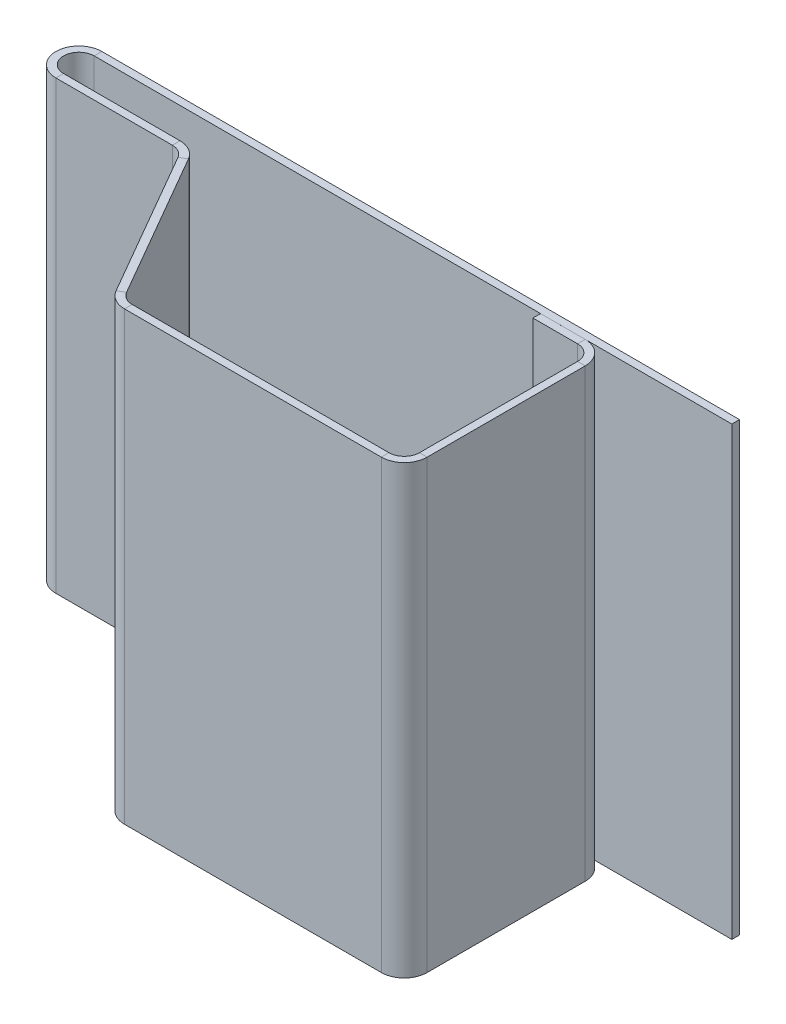
ISO-10303-21;
HEADER;
FILE_DESCRIPTION(('STEP AP214'),'2;1');
FILE_NAME('part.step','',(''),(''),'','','');
FILE_SCHEMA(('AUTOMOTIVE_DESIGN { 1 0 10303 214 1 1 1 1 }'));
ENDSEC;
DATA;
#1=APPLICATION_CONTEXT('core data for automotive mechanical design processes');
#2=APPLICATION_PROTOCOL_DEFINITION('international standard','automotive_design',2000,#1);
#3=PRODUCT_CONTEXT('',#1,'mechanical');
#4=PRODUCT('Part','Part','',(#3));
#5=PRODUCT_RELATED_PRODUCT_CATEGORY('part','',(#4));
#6=PRODUCT_DEFINITION_FORMATION('','',#4);
#7=PRODUCT_DEFINITION_CONTEXT('part definition',#1,'design');
#8=PRODUCT_DEFINITION('design','',#6,#7);
#9=PRODUCT_DEFINITION_SHAPE('','',#8);
#10=(LENGTH_UNIT() NAMED_UNIT(*) SI_UNIT(.MILLI.,.METRE.));
#11=(NAMED_UNIT(*) PLANE_ANGLE_UNIT() SI_UNIT($,.RADIAN.));
#12=(NAMED_UNIT(*) SI_UNIT($,.STERADIAN.) SOLID_ANGLE_UNIT());
#13=UNCERTAINTY_MEASURE_WITH_UNIT(LENGTH_MEASURE(1.E-05),#10,'distance_accuracy_value','');
#14=(GEOMETRIC_REPRESENTATION_CONTEXT(3) GLOBAL_UNCERTAINTY_ASSIGNED_CONTEXT((#13)) GLOBAL_UNIT_ASSIGNED_CONTEXT((#10,
#11,#12)) REPRESENTATION_CONTEXT('',''));
#15=CARTESIAN_POINT('',(0.,0.,0.));
#16=DIRECTION('',(0.,0.,1.));
#17=DIRECTION('',(1.,0.,0.));
#18=AXIS2_PLACEMENT_3D('',#15,#16,#17);
#19=CARTESIAN_POINT('',(-23.0000000000001,35.0000000000001,28.9807621135332));
#20=DIRECTION('',(0.,-1.,0.));
#21=DIRECTION('',(0.,0.,-1.));
#22=AXIS2_PLACEMENT_3D('',#19,#20,#21);
#23=PLANE('',#22);
#24=DIRECTION('',(1.,0.,0.));
#25=VECTOR('',#24,1.);
#26=CARTESIAN_POINT('',(-19.4000000000001,35.0000000000001,28.9807621135331));
#27=LINE('',#26,#25);
#28=CARTESIAN_POINT('',(-20.6000000000001,35.0000000000001,28.9807621135331));
#29=VERTEX_POINT('',#28);
#30=CARTESIAN_POINT('',(-19.4000000000001,35.0000000000001,28.9807621135331));
#31=VERTEX_POINT('',#30);
#32=EDGE_CURVE('E11',#29,#31,#27,.T.);
#33=ORIENTED_EDGE('',*,*,#32,.F.);
#34=CARTESIAN_POINT('',(-23.0000000000001,35.0000000000001,28.9807621135332));
#35=DIRECTION('',(0.,1.,0.));
#36=DIRECTION('',(0.,0.,1.));
#37=AXIS2_PLACEMENT_3D('',#34,#35,#36);
#38=CIRCLE('',#37,2.4);
#39=CARTESIAN_POINT('',(-23.0000000000001,35.0000000000001,31.3807621135332));
#40=VERTEX_POINT('',#39);
#41=EDGE_CURVE('E139',#40,#29,#38,.T.);
#42=ORIENTED_EDGE('',*,*,#41,.F.);
#43=DIRECTION('',(0.,0.,1.));
#44=VECTOR('',#43,1.);
#45=CARTESIAN_POINT('',(-23.0000000000001,35.0000000000001,32.5807621135332));
#46=LINE('',#45,#44);
#47=CARTESIAN_POINT('',(-23.0000000000001,35.0000000000001,32.5807621135332));
#48=VERTEX_POINT('',#47);
#49=EDGE_CURVE('E51',#40,#48,#46,.T.);
#50=ORIENTED_EDGE('',*,*,#49,.T.);
#51=CARTESIAN_POINT('',(-23.0000000000001,35.0000000000001,28.9807621135332));
#52=DIRECTION('',(0.,1.,0.));
#53=DIRECTION('',(0.,0.,1.));
#54=AXIS2_PLACEMENT_3D('',#51,#52,#53);
#55=CIRCLE('',#54,3.6);
#56=EDGE_CURVE('E142',#48,#31,#55,.T.);
#57=ORIENTED_EDGE('',*,*,#56,.T.);
#58=EDGE_LOOP('',(#33,#42,#50,#57));
#59=FACE_BOUND('',#58,.T.);
#60=ADVANCED_FACE('F41',(#59),#23,.F.);
#61=CARTESIAN_POINT('',(-63.2679491924312,35.0000000000001,32.5807621135332));
#62=DIRECTION('',(0.,1.,0.));
#63=DIRECTION('',(1.,0.,0.));
#64=AXIS2_PLACEMENT_3D('',#61,#62,#63);
#65=PLANE('',#64);
#66=ORIENTED_EDGE('',*,*,#49,.F.);
#67=DIRECTION('',(-1.,0.,0.));
#68=VECTOR('',#67,1.);
#69=CARTESIAN_POINT('',(-63.2679491924312,35.0000000000001,31.3807621135332));
#70=LINE('',#69,#68);
#71=CARTESIAN_POINT('',(-63.2679491924312,35.0000000000001,31.3807621135332));
#72=VERTEX_POINT('',#71);
#73=EDGE_CURVE('E319',#72,#40,#70,.F.);
#74=ORIENTED_EDGE('',*,*,#73,.F.);
#75=DIRECTION('',(0.,0.,1.));
#76=VECTOR('',#75,1.);
#77=CARTESIAN_POINT('',(-63.2679491924312,35.0000000000001,32.5807621135332));
#78=LINE('',#77,#76);
#79=CARTESIAN_POINT('',(-63.2679491924312,35.0000000000001,32.5807621135332));
#80=VERTEX_POINT('',#79);
#81=EDGE_CURVE('E238',#72,#80,#78,.T.);
#82=ORIENTED_EDGE('',*,*,#81,.T.);
#83=DIRECTION('',(1.,0.,0.));
#84=VECTOR('',#83,1.);
#85=CARTESIAN_POINT('',(-63.2679491924312,35.0000000000001,32.5807621135332));
#86=LINE('',#85,#84);
#87=EDGE_CURVE('E259',#80,#48,#86,.T.);
#88=ORIENTED_EDGE('',*,*,#87,.T.);
#89=EDGE_LOOP('',(#66,#74,#82,#88));
#90=FACE_BOUND('',#89,.T.);
#91=ADVANCED_FACE('F260',(#90),#65,.T.);
#92=CARTESIAN_POINT('',(-63.2679491924312,35.0000000000001,28.9807621135332));
#93=DIRECTION('',(0.,-1.,0.));
#94=DIRECTION('',(0.,0.,-1.));
#95=AXIS2_PLACEMENT_3D('',#92,#93,#94);
#96=PLANE('',#95);
#97=ORIENTED_EDGE('',*,*,#81,.F.);
#98=CARTESIAN_POINT('',(-63.2679491924312,35.0000000000001,28.9807621135332));
#99=DIRECTION('',(0.,1.,0.));
#100=DIRECTION('',(0.,0.,1.));
#101=AXIS2_PLACEMENT_3D('',#98,#99,#100);
#102=CIRCLE('',#101,2.39999999999998);
#103=CARTESIAN_POINT('',(-65.3464101615138,35.0000000000001,30.1807621135332));
#104=VERTEX_POINT('',#103);
#105=EDGE_CURVE('E177',#104,#72,#102,.T.);
#106=ORIENTED_EDGE('',*,*,#105,.F.);
#107=DIRECTION('',(-0.86602540378444,0.,0.499999999999998));
#108=VECTOR('',#107,1.);
#109=CARTESIAN_POINT('',(-66.3856406460552,35.0000000000001,30.7807621135332));
#110=LINE('',#109,#108);
#111=CARTESIAN_POINT('',(-66.3856406460552,35.0000000000001,30.7807621135332));
#112=VERTEX_POINT('',#111);
#113=EDGE_CURVE('E235',#104,#112,#110,.T.);
#114=ORIENTED_EDGE('',*,*,#113,.T.);
#115=CARTESIAN_POINT('',(-63.2679491924312,35.0000000000001,28.9807621135332));
#116=DIRECTION('',(0.,1.,0.));
#117=DIRECTION('',(-0.86602540378444,0.,0.499999999999998));
#118=AXIS2_PLACEMENT_3D('',#115,#116,#117);
#119=CIRCLE('',#118,3.59999999999998);
#120=EDGE_CURVE('E273',#112,#80,#119,.T.);
#121=ORIENTED_EDGE('',*,*,#120,.T.);
#122=EDGE_LOOP('',(#97,#106,#114,#121));
#123=FACE_BOUND('',#122,.T.);
#124=ADVANCED_FACE('F396',(#123),#96,.F.);
#125=CARTESIAN_POINT('',(-79.6535898384862,35.0000000000001,7.8));
#126=DIRECTION('',(0.,1.,0.));
#127=DIRECTION('',(0.499999999999998,0.,0.86602540378444));
#128=AXIS2_PLACEMENT_3D('',#125,#126,#127);
#129=PLANE('',#128);
#130=ORIENTED_EDGE('',*,*,#113,.F.);
#131=DIRECTION('',(-0.499999999999998,0.,-0.86602540378444));
#132=VECTOR('',#131,1.);
#133=CARTESIAN_POINT('',(-78.6143593539449,35.0000000000001,7.20000000000001));
#134=LINE('',#133,#132);
#135=CARTESIAN_POINT('',(-78.6143593539449,35.0000000000001,7.20000000000001));
#136=VERTEX_POINT('',#135);
#137=EDGE_CURVE('E328',#136,#104,#134,.F.);
#138=ORIENTED_EDGE('',*,*,#137,.F.);
#139=DIRECTION('',(-0.866025403784439,0.,0.499999999999999));
#140=VECTOR('',#139,1.);
#141=CARTESIAN_POINT('',(-79.6535898384862,35.0000000000001,7.8));
#142=LINE('',#141,#140);
#143=CARTESIAN_POINT('',(-79.6535898384862,35.0000000000001,7.8));
#144=VERTEX_POINT('',#143);
#145=EDGE_CURVE('E232',#136,#144,#142,.T.);
#146=ORIENTED_EDGE('',*,*,#145,.T.);
#147=DIRECTION('',(0.499999999999998,0.,0.86602540378444));
#148=VECTOR('',#147,1.);
#149=CARTESIAN_POINT('',(-79.6535898384862,35.0000000000001,7.8));
#150=LINE('',#149,#148);
#151=EDGE_CURVE('E422',#144,#112,#150,.T.);
#152=ORIENTED_EDGE('',*,*,#151,.T.);
#153=EDGE_LOOP('',(#130,#138,#146,#152));
#154=FACE_BOUND('',#153,.T.);
#155=ADVANCED_FACE('F550',(#154),#129,.T.);
#156=CARTESIAN_POINT('',(-81.7320508075689,35.0000000000001,9.));
#157=DIRECTION('',(0.,1.,0.));
#158=DIRECTION('',(0.,0.,1.));
#159=AXIS2_PLACEMENT_3D('',#156,#157,#158);
#160=PLANE('',#159);
#161=ORIENTED_EDGE('',*,*,#145,.F.);
#162=CARTESIAN_POINT('',(-81.7320508075689,35.0000000000001,9.));
#163=DIRECTION('',(0.,-1.,0.));
#164=DIRECTION('',(0.,0.,-1.));
#165=AXIS2_PLACEMENT_3D('',#162,#163,#164);
#166=CIRCLE('',#165,3.6);
#167=CARTESIAN_POINT('',(-81.7320508075689,35.0000000000001,5.4));
#168=VERTEX_POINT('',#167);
#169=EDGE_CURVE('E323',#168,#136,#166,.T.);
#170=ORIENTED_EDGE('',*,*,#169,.F.);
#171=DIRECTION('',(0.,0.,1.));
#172=VECTOR('',#171,1.);
#173=CARTESIAN_POINT('',(-81.7320508075689,35.0000000000001,6.6));
#174=LINE('',#173,#172);
#175=CARTESIAN_POINT('',(-81.7320508075689,35.0000000000001,6.6));
#176=VERTEX_POINT('',#175);
#177=EDGE_CURVE('E229',#168,#176,#174,.T.);
#178=ORIENTED_EDGE('',*,*,#177,.T.);
#179=CARTESIAN_POINT('',(-81.7320508075689,35.0000000000001,9.));
#180=DIRECTION('',(0.,-1.,0.));
#181=DIRECTION('',(0.,0.,-1.));
#182=AXIS2_PLACEMENT_3D('',#179,#180,#181);
#183=CIRCLE('',#182,2.4);
#184=EDGE_CURVE('E410',#176,#144,#183,.T.);
#185=ORIENTED_EDGE('',*,*,#184,.T.);
#186=EDGE_LOOP('',(#161,#170,#178,#185));
#187=FACE_BOUND('',#186,.T.);
#188=ADVANCED_FACE('F553',(#187),#160,.T.);
#189=CARTESIAN_POINT('',(-100.,35.0000000000001,6.60000000000001));
#190=DIRECTION('',(0.,1.,0.));
#191=DIRECTION('',(1.,0.,0.));
#192=AXIS2_PLACEMENT_3D('',#189,#190,#191);
#193=PLANE('',#192);
#194=ORIENTED_EDGE('',*,*,#177,.F.);
#195=DIRECTION('',(-1.,0.,0.));
#196=VECTOR('',#195,1.);
#197=CARTESIAN_POINT('',(-100.,35.0000000000001,5.40000000000001));
#198=LINE('',#197,#196);
#199=CARTESIAN_POINT('',(-100.,35.0000000000001,5.40000000000001));
#200=VERTEX_POINT('',#199);
#201=EDGE_CURVE('E337',#200,#168,#198,.F.);
#202=ORIENTED_EDGE('',*,*,#201,.F.);
#203=DIRECTION('',(0.,0.,1.));
#204=VECTOR('',#203,1.);
#205=CARTESIAN_POINT('',(-100.,35.0000000000001,6.6));
#206=LINE('',#205,#204);
#207=CARTESIAN_POINT('',(-100.,35.0000000000001,6.6));
#208=VERTEX_POINT('',#207);
#209=EDGE_CURVE('E226',#200,#208,#206,.T.);
#210=ORIENTED_EDGE('',*,*,#209,.T.);
#211=DIRECTION('',(1.,0.,0.));
#212=VECTOR('',#211,1.);
#213=CARTESIAN_POINT('',(-100.,35.0000000000001,6.60000000000001));
#214=LINE('',#213,#212);
#215=EDGE_CURVE('E439',#208,#176,#214,.T.);
#216=ORIENTED_EDGE('',*,*,#215,.T.);
#217=EDGE_LOOP('',(#194,#202,#210,#216));
#218=FACE_BOUND('',#217,.T.);
#219=ADVANCED_FACE('F557',(#218),#193,.T.);
#220=CARTESIAN_POINT('',(-100.,35.0000000000001,3.));
#221=DIRECTION('',(0.,-1.,0.));
#222=DIRECTION('',(0.,0.,-1.));
#223=AXIS2_PLACEMENT_3D('',#220,#221,#222);
#224=PLANE('',#223);
#225=ORIENTED_EDGE('',*,*,#209,.F.);
#226=CARTESIAN_POINT('',(-100.,35.0000000000001,3.));
#227=DIRECTION('',(0.,1.,0.));
#228=DIRECTION('',(0.,0.,1.));
#229=AXIS2_PLACEMENT_3D('',#226,#227,#228);
#230=CIRCLE('',#229,2.4);
#231=CARTESIAN_POINT('',(-100.,35.0000000000001,0.599999999999996));
#232=VERTEX_POINT('',#231);
#233=EDGE_CURVE('E332',#232,#200,#230,.T.);
#234=ORIENTED_EDGE('',*,*,#233,.F.);
#235=DIRECTION('',(0.,0.,-1.));
#236=VECTOR('',#235,1.);
#237=CARTESIAN_POINT('',(-100.,35.0000000000001,-0.600000000000001));
#238=LINE('',#237,#236);
#239=CARTESIAN_POINT('',(-100.,35.0000000000001,-0.600000000000001));
#240=VERTEX_POINT('',#239);
#241=EDGE_CURVE('E223',#232,#240,#238,.T.);
#242=ORIENTED_EDGE('',*,*,#241,.T.);
#243=CARTESIAN_POINT('',(-100.,35.0000000000001,3.));
#244=DIRECTION('',(0.,1.,0.));
#245=DIRECTION('',(0.,0.,-1.));
#246=AXIS2_PLACEMENT_3D('',#243,#244,#245);
#247=CIRCLE('',#246,3.6);
#248=EDGE_CURVE('E427',#240,#208,#247,.T.);
#249=ORIENTED_EDGE('',*,*,#248,.T.);
#250=EDGE_LOOP('',(#225,#234,#242,#249));
#251=FACE_BOUND('',#250,.T.);
#252=ADVANCED_FACE('F561',(#251),#224,.F.);
#253=CARTESIAN_POINT('',(0.,35.0000000000001,-0.600000000000001));
#254=DIRECTION('',(0.,1.,0.));
#255=DIRECTION('',(-1.,0.,0.));
#256=AXIS2_PLACEMENT_3D('',#253,#254,#255);
#257=PLANE('',#256);
#258=ORIENTED_EDGE('',*,*,#241,.F.);
#259=DIRECTION('',(1.,0.,0.));
#260=VECTOR('',#259,1.);
#261=CARTESIAN_POINT('',(0.,35.0000000000001,0.599999999999999));
#262=LINE('',#261,#260);
#263=CARTESIAN_POINT('',(0.,35.0000000000001,0.599999999999999));
#264=VERTEX_POINT('',#263);
#265=EDGE_CURVE('E374',#264,#232,#262,.F.);
#266=ORIENTED_EDGE('',*,*,#265,.F.);
#267=DIRECTION('',(0.,0.,-1.));
#268=VECTOR('',#267,1.);
#269=CARTESIAN_POINT('',(0.,35.0000000000001,-0.600000000000001));
#270=LINE('',#269,#268);
#271=CARTESIAN_POINT('',(0.,35.0000000000001,-0.600000000000001));
#272=VERTEX_POINT('',#271);
#273=EDGE_CURVE('E220',#264,#272,#270,.T.);
#274=ORIENTED_EDGE('',*,*,#273,.T.);
#275=DIRECTION('',(-1.,0.,0.));
#276=VECTOR('',#275,1.);
#277=CARTESIAN_POINT('',(0.,35.0000000000001,-0.600000000000001));
#278=LINE('',#277,#276);
#279=EDGE_CURVE('E354',#272,#240,#278,.T.);
#280=ORIENTED_EDGE('',*,*,#279,.T.);
#281=EDGE_LOOP('',(#258,#266,#274,#280));
#282=FACE_BOUND('',#281,.T.);
#283=ADVANCED_FACE('F455',(#282),#257,.T.);
#284=CARTESIAN_POINT('',(0.,-34.9999999999999,-0.600000000000001));
#285=DIRECTION('',(1.,0.,0.));
#286=DIRECTION('',(0.,1.,0.));
#287=AXIS2_PLACEMENT_3D('',#284,#285,#286);
#288=PLANE('',#287);
#289=ORIENTED_EDGE('',*,*,#273,.F.);
#290=DIRECTION('',(0.,1.,0.));
#291=VECTOR('',#290,1.);
#292=CARTESIAN_POINT('',(0.,-34.9999999999999,0.599999999999999));
#293=LINE('',#292,#291);
#294=CARTESIAN_POINT('',(0.,-34.9999999999999,0.599999999999999));
#295=VERTEX_POINT('',#294);
#296=EDGE_CURVE('E371',#295,#264,#293,.T.);
#297=ORIENTED_EDGE('',*,*,#296,.F.);
#298=DIRECTION('',(0.,0.,-1.));
#299=VECTOR('',#298,1.);
#300=CARTESIAN_POINT('',(0.,-34.9999999999999,-0.600000000000001));
#301=LINE('',#300,#299);
#302=CARTESIAN_POINT('',(0.,-34.9999999999999,-0.600000000000001));
#303=VERTEX_POINT('',#302);
#304=EDGE_CURVE('E217',#295,#303,#301,.T.);
#305=ORIENTED_EDGE('',*,*,#304,.T.);
#306=DIRECTION('',(0.,1.,0.));
#307=VECTOR('',#306,1.);
#308=CARTESIAN_POINT('',(0.,-34.9999999999999,-0.600000000000001));
#309=LINE('',#308,#307);
#310=EDGE_CURVE('E448',#303,#272,#309,.T.);
#311=ORIENTED_EDGE('',*,*,#310,.T.);
#312=EDGE_LOOP('',(#289,#297,#305,#311));
#313=FACE_BOUND('',#312,.T.);
#314=ADVANCED_FACE('F568',(#313),#288,.T.);
#315=CARTESIAN_POINT('',(0.,-34.9999999999999,-0.600000000000001));
#316=DIRECTION('',(0.,1.,0.));
#317=DIRECTION('',(-1.,0.,0.));
#318=AXIS2_PLACEMENT_3D('',#315,#316,#317);
#319=PLANE('',#318);
#320=ORIENTED_EDGE('',*,*,#304,.F.);
#321=DIRECTION('',(1.,0.,0.));
#322=VECTOR('',#321,1.);
#323=CARTESIAN_POINT('',(0.,-34.9999999999999,0.599999999999999));
#324=LINE('',#323,#322);
#325=CARTESIAN_POINT('',(-100.,-34.9999999999999,0.599999999999999));
#326=VERTEX_POINT('',#325);
#327=EDGE_CURVE('E341',#295,#326,#324,.F.);
#328=ORIENTED_EDGE('',*,*,#327,.T.);
#329=DIRECTION('',(0.,0.,-1.));
#330=VECTOR('',#329,1.);
#331=CARTESIAN_POINT('',(-100.,-34.9999999999999,-0.600000000000001));
#332=LINE('',#331,#330);
#333=CARTESIAN_POINT('',(-100.,-34.9999999999999,-0.600000000000001));
#334=VERTEX_POINT('',#333);
#335=EDGE_CURVE('E214',#326,#334,#332,.T.);
#336=ORIENTED_EDGE('',*,*,#335,.T.);
#337=DIRECTION('',(-1.,0.,0.));
#338=VECTOR('',#337,1.);
#339=CARTESIAN_POINT('',(0.,-34.9999999999999,-0.600000000000001));
#340=LINE('',#339,#338);
#341=EDGE_CURVE('E445',#303,#334,#340,.T.);
#342=ORIENTED_EDGE('',*,*,#341,.F.);
#343=EDGE_LOOP('',(#320,#328,#336,#342));
#344=FACE_BOUND('',#343,.T.);
#345=ADVANCED_FACE('F571',(#344),#319,.F.);
#346=CARTESIAN_POINT('',(-100.,-34.9999999999999,3.));
#347=DIRECTION('',(0.,-1.,0.));
#348=DIRECTION('',(0.,0.,-1.));
#349=AXIS2_PLACEMENT_3D('',#346,#347,#348);
#350=PLANE('',#349);
#351=ORIENTED_EDGE('',*,*,#335,.F.);
#352=CARTESIAN_POINT('',(-100.,-34.9999999999999,3.));
#353=DIRECTION('',(0.,1.,0.));
#354=DIRECTION('',(0.,0.,1.));
#355=AXIS2_PLACEMENT_3D('',#352,#353,#354);
#356=CIRCLE('',#355,2.4);
#357=CARTESIAN_POINT('',(-100.,-34.9999999999999,5.40000000000001));
#358=VERTEX_POINT('',#357);
#359=EDGE_CURVE('E366',#326,#358,#356,.T.);
#360=ORIENTED_EDGE('',*,*,#359,.T.);
#361=DIRECTION('',(0.,0.,1.));
#362=VECTOR('',#361,1.);
#363=CARTESIAN_POINT('',(-100.,-34.9999999999999,6.6));
#364=LINE('',#363,#362);
#365=CARTESIAN_POINT('',(-100.,-34.9999999999999,6.6));
#366=VERTEX_POINT('',#365);
#367=EDGE_CURVE('E211',#358,#366,#364,.T.);
#368=ORIENTED_EDGE('',*,*,#367,.T.);
#369=CARTESIAN_POINT('',(-100.,-34.9999999999999,3.));
#370=DIRECTION('',(0.,1.,0.));
#371=DIRECTION('',(0.,0.,-1.));
#372=AXIS2_PLACEMENT_3D('',#369,#370,#371);
#373=CIRCLE('',#372,3.6);
#374=EDGE_CURVE('E424',#334,#366,#373,.T.);
#375=ORIENTED_EDGE('',*,*,#374,.F.);
#376=EDGE_LOOP('',(#351,#360,#368,#375));
#377=FACE_BOUND('',#376,.T.);
#378=ADVANCED_FACE('F575',(#377),#350,.T.);
#379=CARTESIAN_POINT('',(-100.,-34.9999999999999,6.60000000000001));
#380=DIRECTION('',(0.,1.,0.));
#381=DIRECTION('',(1.,0.,0.));
#382=AXIS2_PLACEMENT_3D('',#379,#380,#381);
#383=PLANE('',#382);
#384=ORIENTED_EDGE('',*,*,#367,.F.);
#385=DIRECTION('',(-1.,0.,0.));
#386=VECTOR('',#385,1.);
#387=CARTESIAN_POINT('',(-100.,-34.9999999999999,5.40000000000001));
#388=LINE('',#387,#386);
#389=CARTESIAN_POINT('',(-81.7320508075689,-34.9999999999999,5.4));
#390=VERTEX_POINT('',#389);
#391=EDGE_CURVE('E333',#358,#390,#388,.F.);
#392=ORIENTED_EDGE('',*,*,#391,.T.);
#393=DIRECTION('',(0.,0.,1.));
#394=VECTOR('',#393,1.);
#395=CARTESIAN_POINT('',(-81.7320508075689,-34.9999999999999,6.6));
#396=LINE('',#395,#394);
#397=CARTESIAN_POINT('',(-81.7320508075689,-34.9999999999999,6.6));
#398=VERTEX_POINT('',#397);
#399=EDGE_CURVE('E208',#390,#398,#396,.T.);
#400=ORIENTED_EDGE('',*,*,#399,.T.);
#401=DIRECTION('',(1.,0.,0.));
#402=VECTOR('',#401,1.);
#403=CARTESIAN_POINT('',(-100.,-34.9999999999999,6.60000000000001));
#404=LINE('',#403,#402);
#405=EDGE_CURVE('E433',#366,#398,#404,.T.);
#406=ORIENTED_EDGE('',*,*,#405,.F.);
#407=EDGE_LOOP('',(#384,#392,#400,#406));
#408=FACE_BOUND('',#407,.T.);
#409=ADVANCED_FACE('F578',(#408),#383,.F.);
#410=CARTESIAN_POINT('',(-81.7320508075689,-34.9999999999999,9.));
#411=DIRECTION('',(0.,1.,0.));
#412=DIRECTION('',(0.,0.,1.));
#413=AXIS2_PLACEMENT_3D('',#410,#411,#412);
#414=PLANE('',#413);
#415=ORIENTED_EDGE('',*,*,#399,.F.);
#416=CARTESIAN_POINT('',(-81.7320508075689,-34.9999999999999,9.));
#417=DIRECTION('',(0.,-1.,0.));
#418=DIRECTION('',(0.,0.,-1.));
#419=AXIS2_PLACEMENT_3D('',#416,#417,#418);
#420=CIRCLE('',#419,3.6);
#421=CARTESIAN_POINT('',(-78.6143593539449,-34.9999999999999,7.20000000000001));
#422=VERTEX_POINT('',#421);
#423=EDGE_CURVE('E361',#390,#422,#420,.T.);
#424=ORIENTED_EDGE('',*,*,#423,.T.);
#425=DIRECTION('',(-0.86602540378444,0.,0.499999999999998));
#426=VECTOR('',#425,1.);
#427=CARTESIAN_POINT('',(-79.6535898384862,-34.9999999999999,7.8));
#428=LINE('',#427,#426);
#429=CARTESIAN_POINT('',(-79.6535898384862,-34.9999999999999,7.8));
#430=VERTEX_POINT('',#429);
#431=EDGE_CURVE('E205',#422,#430,#428,.T.);
#432=ORIENTED_EDGE('',*,*,#431,.T.);
#433=CARTESIAN_POINT('',(-81.7320508075689,-34.9999999999999,9.));
#434=DIRECTION('',(0.,-1.,0.));
#435=DIRECTION('',(0.,0.,-1.));
#436=AXIS2_PLACEMENT_3D('',#433,#434,#435);
#437=CIRCLE('',#436,2.4);
#438=EDGE_CURVE('E266',#398,#430,#437,.T.);
#439=ORIENTED_EDGE('',*,*,#438,.F.);
#440=EDGE_LOOP('',(#415,#424,#432,#439));
#441=FACE_BOUND('',#440,.T.);
#442=ADVANCED_FACE('F582',(#441),#414,.F.);
#443=CARTESIAN_POINT('',(-79.6535898384862,-34.9999999999999,7.8));
#444=DIRECTION('',(0.,1.,0.));
#445=DIRECTION('',(0.499999999999998,0.,0.86602540378444));
#446=AXIS2_PLACEMENT_3D('',#443,#444,#445);
#447=PLANE('',#446);
#448=ORIENTED_EDGE('',*,*,#431,.F.);
#449=DIRECTION('',(-0.499999999999998,0.,-0.86602540378444));
#450=VECTOR('',#449,1.);
#451=CARTESIAN_POINT('',(-78.6143593539449,-34.9999999999999,7.20000000000001));
#452=LINE('',#451,#450);
#453=CARTESIAN_POINT('',(-65.3464101615138,-34.9999999999999,30.1807621135332));
#454=VERTEX_POINT('',#453);
#455=EDGE_CURVE('E324',#422,#454,#452,.F.);
#456=ORIENTED_EDGE('',*,*,#455,.T.);
#457=DIRECTION('',(-0.866025403784441,0.,0.499999999999996));
#458=VECTOR('',#457,1.);
#459=CARTESIAN_POINT('',(-66.3856406460552,-34.9999999999999,30.7807621135332));
#460=LINE('',#459,#458);
#461=CARTESIAN_POINT('',(-66.3856406460552,-34.9999999999999,30.7807621135332));
#462=VERTEX_POINT('',#461);
#463=EDGE_CURVE('E202',#454,#462,#460,.T.);
#464=ORIENTED_EDGE('',*,*,#463,.T.);
#465=DIRECTION('',(0.499999999999998,0.,0.86602540378444));
#466=VECTOR('',#465,1.);
#467=CARTESIAN_POINT('',(-79.6535898384862,-34.9999999999999,7.8));
#468=LINE('',#467,#466);
#469=EDGE_CURVE('E416',#430,#462,#468,.T.);
#470=ORIENTED_EDGE('',*,*,#469,.F.);
#471=EDGE_LOOP('',(#448,#456,#464,#470));
#472=FACE_BOUND('',#471,.T.);
#473=ADVANCED_FACE('F586',(#472),#447,.F.);
#474=CARTESIAN_POINT('',(-63.2679491924312,-34.9999999999999,28.9807621135332));
#475=DIRECTION('',(0.,-1.,0.));
#476=DIRECTION('',(0.,0.,-1.));
#477=AXIS2_PLACEMENT_3D('',#474,#475,#476);
#478=PLANE('',#477);
#479=ORIENTED_EDGE('',*,*,#463,.F.);
#480=CARTESIAN_POINT('',(-63.2679491924312,-34.9999999999999,28.9807621135332));
#481=DIRECTION('',(0.,1.,0.));
#482=DIRECTION('',(0.,0.,1.));
#483=AXIS2_PLACEMENT_3D('',#480,#481,#482);
#484=CIRCLE('',#483,2.39999999999998);
#485=CARTESIAN_POINT('',(-63.2679491924312,-34.9999999999999,31.3807621135332));
#486=VERTEX_POINT('',#485);
#487=EDGE_CURVE('E174',#454,#486,#484,.T.);
#488=ORIENTED_EDGE('',*,*,#487,.T.);
#489=DIRECTION('',(0.,0.,1.));
#490=VECTOR('',#489,1.);
#491=CARTESIAN_POINT('',(-63.2679491924312,-34.9999999999999,32.5807621135332));
#492=LINE('',#491,#490);
#493=CARTESIAN_POINT('',(-63.2679491924312,-34.9999999999999,32.5807621135332));
#494=VERTEX_POINT('',#493);
#495=EDGE_CURVE('E199',#486,#494,#492,.T.);
#496=ORIENTED_EDGE('',*,*,#495,.T.);
#497=CARTESIAN_POINT('',(-63.2679491924312,-34.9999999999999,28.9807621135332));
#498=DIRECTION('',(0.,1.,0.));
#499=DIRECTION('',(-0.86602540378444,0.,0.499999999999998));
#500=AXIS2_PLACEMENT_3D('',#497,#498,#499);
#501=CIRCLE('',#500,3.59999999999998);
#502=EDGE_CURVE('E275',#462,#494,#501,.T.);
#503=ORIENTED_EDGE('',*,*,#502,.F.);
#504=EDGE_LOOP('',(#479,#488,#496,#503));
#505=FACE_BOUND('',#504,.T.);
#506=ADVANCED_FACE('F590',(#505),#478,.T.);
#507=CARTESIAN_POINT('',(-63.2679491924312,-34.9999999999999,32.5807621135332));
#508=DIRECTION('',(0.,1.,0.));
#509=DIRECTION('',(1.,0.,0.));
#510=AXIS2_PLACEMENT_3D('',#507,#508,#509);
#511=PLANE('',#510);
#512=ORIENTED_EDGE('',*,*,#495,.F.);
#513=DIRECTION('',(-1.,0.,0.));
#514=VECTOR('',#513,1.);
#515=CARTESIAN_POINT('',(-63.2679491924312,-34.9999999999999,31.3807621135332));
#516=LINE('',#515,#514);
#517=CARTESIAN_POINT('',(-23.0000000000001,-34.9999999999999,31.3807621135332));
#518=VERTEX_POINT('',#517);
#519=EDGE_CURVE('E315',#486,#518,#516,.F.);
#520=ORIENTED_EDGE('',*,*,#519,.T.);
#521=DIRECTION('',(0.,0.,1.));
#522=VECTOR('',#521,1.);
#523=CARTESIAN_POINT('',(-23.0000000000001,-34.9999999999999,32.5807621135332));
#524=LINE('',#523,#522);
#525=CARTESIAN_POINT('',(-23.0000000000001,-34.9999999999999,32.5807621135332));
#526=VERTEX_POINT('',#525);
#527=EDGE_CURVE('E196',#518,#526,#524,.T.);
#528=ORIENTED_EDGE('',*,*,#527,.T.);
#529=DIRECTION('',(1.,0.,0.));
#530=VECTOR('',#529,1.);
#531=CARTESIAN_POINT('',(-63.2679491924312,-34.9999999999999,32.5807621135332));
#532=LINE('',#531,#530);
#533=EDGE_CURVE('E271',#494,#526,#532,.T.);
#534=ORIENTED_EDGE('',*,*,#533,.F.);
#535=EDGE_LOOP('',(#512,#520,#528,#534));
#536=FACE_BOUND('',#535,.T.);
#537=ADVANCED_FACE('F594',(#536),#511,.F.);
#538=CARTESIAN_POINT('',(-23.0000000000001,-34.9999999999999,28.9807621135332));
#539=DIRECTION('',(0.,-1.,0.));
#540=DIRECTION('',(0.,0.,-1.));
#541=AXIS2_PLACEMENT_3D('',#538,#539,#540);
#542=PLANE('',#541);
#543=ORIENTED_EDGE('',*,*,#527,.F.);
#544=CARTESIAN_POINT('',(-23.0000000000001,-34.9999999999999,28.9807621135332));
#545=DIRECTION('',(0.,1.,0.));
#546=DIRECTION('',(0.,0.,1.));
#547=AXIS2_PLACEMENT_3D('',#544,#545,#546);
#548=CIRCLE('',#547,2.4);
#549=CARTESIAN_POINT('',(-20.6000000000001,-34.9999999999999,28.9807621135331));
#550=VERTEX_POINT('',#549);
#551=EDGE_CURVE('E168',#518,#550,#548,.T.);
#552=ORIENTED_EDGE('',*,*,#551,.T.);
#553=DIRECTION('',(1.,0.,0.));
#554=VECTOR('',#553,1.);
#555=CARTESIAN_POINT('',(-19.4000000000001,-34.9999999999999,28.9807621135331));
#556=LINE('',#555,#554);
#557=CARTESIAN_POINT('',(-19.4000000000001,-34.9999999999999,28.9807621135331));
#558=VERTEX_POINT('',#557);
#559=EDGE_CURVE('E193',#550,#558,#556,.T.);
#560=ORIENTED_EDGE('',*,*,#559,.T.);
#561=CARTESIAN_POINT('',(-23.0000000000001,-34.9999999999999,28.9807621135332));
#562=DIRECTION('',(0.,1.,0.));
#563=DIRECTION('',(0.,0.,1.));
#564=AXIS2_PLACEMENT_3D('',#561,#562,#563);
#565=CIRCLE('',#564,3.6);
#566=EDGE_CURVE('E255',#526,#558,#565,.T.);
#567=ORIENTED_EDGE('',*,*,#566,.F.);
#568=EDGE_LOOP('',(#543,#552,#560,#567));
#569=FACE_BOUND('',#568,.T.);
#570=ADVANCED_FACE('F598',(#569),#542,.T.);
#571=CARTESIAN_POINT('',(-19.4000000000001,-34.9999999999999,28.9807621135332));
#572=DIRECTION('',(0.,1.,0.));
#573=DIRECTION('',(0.,0.,-1.));
#574=AXIS2_PLACEMENT_3D('',#571,#572,#573);
#575=PLANE('',#574);
#576=ORIENTED_EDGE('',*,*,#559,.F.);
#577=DIRECTION('',(0.,0.,1.));
#578=VECTOR('',#577,1.);
#579=CARTESIAN_POINT('',(-20.6000000000001,-34.9999999999999,28.9807621135332));
#580=LINE('',#579,#578);
#581=CARTESIAN_POINT('',(-20.6000000000001,-34.9999999999999,4.20076211353318));
#582=VERTEX_POINT('',#581);
#583=EDGE_CURVE('E158',#550,#582,#580,.F.);
#584=ORIENTED_EDGE('',*,*,#583,.T.);
#585=DIRECTION('',(1.,0.,0.));
#586=VECTOR('',#585,1.);
#587=CARTESIAN_POINT('',(-19.4000000000001,-34.9999999999999,4.20076211353318));
#588=LINE('',#587,#586);
#589=CARTESIAN_POINT('',(-19.4000000000001,-34.9999999999999,4.20076211353318));
#590=VERTEX_POINT('',#589);
#591=EDGE_CURVE('E190',#582,#590,#588,.T.);
#592=ORIENTED_EDGE('',*,*,#591,.T.);
#593=DIRECTION('',(0.,0.,-1.));
#594=VECTOR('',#593,1.);
#595=CARTESIAN_POINT('',(-19.4000000000001,-34.9999999999999,28.9807621135332));
#596=LINE('',#595,#594);
#597=EDGE_CURVE('E285',#558,#590,#596,.T.);
#598=ORIENTED_EDGE('',*,*,#597,.F.);
#599=EDGE_LOOP('',(#576,#584,#592,#598));
#600=FACE_BOUND('',#599,.T.);
#601=ADVANCED_FACE('F523',(#600),#575,.F.);
#602=CARTESIAN_POINT('',(-23.0000000000001,-34.9999999999999,4.20076211353318));
#603=DIRECTION('',(0.,-1.,0.));
#604=DIRECTION('',(0.,0.,-1.));
#605=AXIS2_PLACEMENT_3D('',#602,#603,#604);
#606=PLANE('',#605);
#607=ORIENTED_EDGE('',*,*,#591,.F.);
#608=CARTESIAN_POINT('',(-23.0000000000001,-34.9999999999999,4.20076211353318));
#609=DIRECTION('',(0.,1.,0.));
#610=DIRECTION('',(0.,0.,1.));
#611=AXIS2_PLACEMENT_3D('',#608,#609,#610);
#612=CIRCLE('',#611,2.4);
#613=CARTESIAN_POINT('',(-23.0000000000001,-34.9999999999999,1.80076211353318));
#614=VERTEX_POINT('',#613);
#615=EDGE_CURVE('E345',#582,#614,#612,.T.);
#616=ORIENTED_EDGE('',*,*,#615,.T.);
#617=DIRECTION('',(0.,0.,-1.));
#618=VECTOR('',#617,1.);
#619=CARTESIAN_POINT('',(-23.0000000000001,-34.9999999999999,0.600762113533175));
#620=LINE('',#619,#618);
#621=CARTESIAN_POINT('',(-23.0000000000001,-34.9999999999999,0.600762113533175));
#622=VERTEX_POINT('',#621);
#623=EDGE_CURVE('E187',#614,#622,#620,.T.);
#624=ORIENTED_EDGE('',*,*,#623,.T.);
#625=CARTESIAN_POINT('',(-23.0000000000001,-34.9999999999999,4.20076211353318));
#626=DIRECTION('',(0.,1.,0.));
#627=DIRECTION('',(1.,0.,0.));
#628=AXIS2_PLACEMENT_3D('',#625,#626,#627);
#629=CIRCLE('',#628,3.6);
#630=EDGE_CURVE('E305',#590,#622,#629,.T.);
#631=ORIENTED_EDGE('',*,*,#630,.F.);
#632=EDGE_LOOP('',(#607,#616,#624,#631));
#633=FACE_BOUND('',#632,.T.);
#634=ADVANCED_FACE('F503',(#633),#606,.T.);
#635=CARTESIAN_POINT('',(-23.0000000000001,-34.9999999999999,0.600762113533176));
#636=DIRECTION('',(0.,1.,0.));
#637=DIRECTION('',(-1.,0.,0.));
#638=AXIS2_PLACEMENT_3D('',#635,#636,#637);
#639=PLANE('',#638);
#640=ORIENTED_EDGE('',*,*,#623,.F.);
#641=DIRECTION('',(1.,0.,0.));
#642=VECTOR('',#641,1.);
#643=CARTESIAN_POINT('',(-23.0000000000001,-34.9999999999999,1.80076211353318));
#644=LINE('',#643,#642);
#645=CARTESIAN_POINT('',(-30.0000000000001,-34.9999999999999,1.80076211353318));
#646=VERTEX_POINT('',#645);
#647=EDGE_CURVE('E311',#614,#646,#644,.F.);
#648=ORIENTED_EDGE('',*,*,#647,.T.);
#649=DIRECTION('',(0.,0.,-1.));
#650=VECTOR('',#649,1.);
#651=CARTESIAN_POINT('',(-30.0000000000001,-34.9999999999999,0.600762113533176));
#652=LINE('',#651,#650);
#653=CARTESIAN_POINT('',(-30.0000000000001,-34.9999999999999,0.600762113533176));
#654=VERTEX_POINT('',#653);
#655=EDGE_CURVE('E185',#646,#654,#652,.T.);
#656=ORIENTED_EDGE('',*,*,#655,.T.);
#657=DIRECTION('',(-1.,0.,0.));
#658=VECTOR('',#657,1.);
#659=CARTESIAN_POINT('',(-23.0000000000001,-34.9999999999999,0.600762113533176));
#660=LINE('',#659,#658);
#661=EDGE_CURVE('E297',#622,#654,#660,.T.);
#662=ORIENTED_EDGE('',*,*,#661,.F.);
#663=EDGE_LOOP('',(#640,#648,#656,#662));
#664=FACE_BOUND('',#663,.T.);
#665=ADVANCED_FACE('F508',(#664),#639,.F.);
#666=CARTESIAN_POINT('',(-30.0000000000001,-34.9999999999999,0.600762113533176));
#667=DIRECTION('',(1.,0.,0.));
#668=DIRECTION('',(0.,1.,0.));
#669=AXIS2_PLACEMENT_3D('',#666,#667,#668);
#670=PLANE('',#669);
#671=ORIENTED_EDGE('',*,*,#655,.F.);
#672=DIRECTION('',(0.,1.,0.));
#673=VECTOR('',#672,1.);
#674=CARTESIAN_POINT('',(-30.0000000000001,-34.9999999999999,1.80076211353318));
#675=LINE('',#674,#673);
#676=CARTESIAN_POINT('',(-30.0000000000001,35.0000000000001,1.80076211353318));
#677=VERTEX_POINT('',#676);
#678=EDGE_CURVE('E346',#646,#677,#675,.T.);
#679=ORIENTED_EDGE('',*,*,#678,.T.);
#680=DIRECTION('',(0.,0.,-1.));
#681=VECTOR('',#680,1.);
#682=CARTESIAN_POINT('',(-30.0000000000001,35.0000000000001,0.600762113533176));
#683=LINE('',#682,#681);
#684=CARTESIAN_POINT('',(-30.0000000000001,35.0000000000001,0.600762113533176));
#685=VERTEX_POINT('',#684);
#686=EDGE_CURVE('E59',#677,#685,#683,.T.);
#687=ORIENTED_EDGE('',*,*,#686,.T.);
#688=DIRECTION('',(0.,1.,0.));
#689=VECTOR('',#688,1.);
#690=CARTESIAN_POINT('',(-30.0000000000001,-34.9999999999999,0.600762113533176));
#691=LINE('',#690,#689);
#692=EDGE_CURVE('E300',#654,#685,#691,.T.);
#693=ORIENTED_EDGE('',*,*,#692,.F.);
#694=EDGE_LOOP('',(#671,#679,#687,#693));
#695=FACE_BOUND('',#694,.T.);
#696=ADVANCED_FACE('F531',(#695),#670,.F.);
#697=CARTESIAN_POINT('',(-23.0000000000001,35.0000000000001,0.600762113533176));
#698=DIRECTION('',(0.,1.,0.));
#699=DIRECTION('',(-1.,0.,0.));
#700=AXIS2_PLACEMENT_3D('',#697,#698,#699);
#701=PLANE('',#700);
#702=ORIENTED_EDGE('',*,*,#686,.F.);
#703=DIRECTION('',(1.,0.,0.));
#704=VECTOR('',#703,1.);
#705=CARTESIAN_POINT('',(-23.0000000000001,35.0000000000001,1.80076211353318));
#706=LINE('',#705,#704);
#707=CARTESIAN_POINT('',(-23.0000000000001,35.0000000000001,1.80076211353318));
#708=VERTEX_POINT('',#707);
#709=EDGE_CURVE('E312',#708,#677,#706,.F.);
#710=ORIENTED_EDGE('',*,*,#709,.F.);
#711=DIRECTION('',(0.,0.,-1.));
#712=VECTOR('',#711,1.);
#713=CARTESIAN_POINT('',(-23.0000000000001,35.0000000000001,0.600762113533175));
#714=LINE('',#713,#712);
#715=CARTESIAN_POINT('',(-23.0000000000001,35.0000000000001,0.600762113533175));
#716=VERTEX_POINT('',#715);
#717=EDGE_CURVE('E181',#708,#716,#714,.T.);
#718=ORIENTED_EDGE('',*,*,#717,.T.);
#719=DIRECTION('',(-1.,0.,0.));
#720=VECTOR('',#719,1.);
#721=CARTESIAN_POINT('',(-23.0000000000001,35.0000000000001,0.600762113533176));
#722=LINE('',#721,#720);
#723=EDGE_CURVE('E291',#716,#685,#722,.T.);
#724=ORIENTED_EDGE('',*,*,#723,.T.);
#725=EDGE_LOOP('',(#702,#710,#718,#724));
#726=FACE_BOUND('',#725,.T.);
#727=ADVANCED_FACE('F533',(#726),#701,.T.);
#728=CARTESIAN_POINT('',(-23.0000000000001,35.0000000000001,4.20076211353318));
#729=DIRECTION('',(0.,-1.,0.));
#730=DIRECTION('',(0.,0.,-1.));
#731=AXIS2_PLACEMENT_3D('',#728,#729,#730);
#732=PLANE('',#731);
#733=ORIENTED_EDGE('',*,*,#717,.F.);
#734=CARTESIAN_POINT('',(-23.0000000000001,35.0000000000001,4.20076211353318));
#735=DIRECTION('',(0.,1.,0.));
#736=DIRECTION('',(0.,0.,1.));
#737=AXIS2_PLACEMENT_3D('',#734,#735,#736);
#738=CIRCLE('',#737,2.4);
#739=CARTESIAN_POINT('',(-20.6000000000001,35.0000000000001,4.20076211353318));
#740=VERTEX_POINT('',#739);
#741=EDGE_CURVE('E342',#740,#708,#738,.T.);
#742=ORIENTED_EDGE('',*,*,#741,.F.);
#743=DIRECTION('',(1.,0.,0.));
#744=VECTOR('',#743,1.);
#745=CARTESIAN_POINT('',(-19.4000000000001,35.0000000000001,4.20076211353318));
#746=LINE('',#745,#744);
#747=CARTESIAN_POINT('',(-19.4000000000001,35.0000000000001,4.20076211353318));
#748=VERTEX_POINT('',#747);
#749=EDGE_CURVE('E45',#740,#748,#746,.T.);
#750=ORIENTED_EDGE('',*,*,#749,.T.);
#751=CARTESIAN_POINT('',(-23.0000000000001,35.0000000000001,4.20076211353318));
#752=DIRECTION('',(0.,1.,0.));
#753=DIRECTION('',(1.,0.,0.));
#754=AXIS2_PLACEMENT_3D('',#751,#752,#753);
#755=CIRCLE('',#754,3.6);
#756=EDGE_CURVE('E302',#748,#716,#755,.T.);
#757=ORIENTED_EDGE('',*,*,#756,.T.);
#758=EDGE_LOOP('',(#733,#742,#750,#757));
#759=FACE_BOUND('',#758,.T.);
#760=ADVANCED_FACE('F518',(#759),#732,.F.);
#761=CARTESIAN_POINT('',(-19.4000000000001,35.0000000000001,28.9807621135332));
#762=DIRECTION('',(0.,1.,0.));
#763=DIRECTION('',(0.,0.,-1.));
#764=AXIS2_PLACEMENT_3D('',#761,#762,#763);
#765=PLANE('',#764);
#766=DIRECTION('',(0.,0.,1.));
#767=VECTOR('',#766,1.);
#768=CARTESIAN_POINT('',(-20.6000000000001,35.0000000000001,28.9807621135332));
#769=LINE('',#768,#767);
#770=EDGE_CURVE('E155',#29,#740,#769,.F.);
#771=ORIENTED_EDGE('',*,*,#770,.F.);
#772=ORIENTED_EDGE('',*,*,#32,.T.);
#773=DIRECTION('',(0.,0.,-1.));
#774=VECTOR('',#773,1.);
#775=CARTESIAN_POINT('',(-19.4000000000001,35.0000000000001,28.9807621135332));
#776=LINE('',#775,#774);
#777=EDGE_CURVE('E282',#31,#748,#776,.T.);
#778=ORIENTED_EDGE('',*,*,#777,.T.);
#779=ORIENTED_EDGE('',*,*,#749,.F.);
#780=EDGE_LOOP('',(#771,#772,#778,#779));
#781=FACE_BOUND('',#780,.T.);
#782=ADVANCED_FACE('F43',(#781),#765,.T.);
#783=CARTESIAN_POINT('',(-23.0000000000001,0.,4.20076211353318));
#784=DIRECTION('',(0.,1.,0.));
#785=DIRECTION('',(0.,0.,1.));
#786=AXIS2_PLACEMENT_3D('',#783,#784,#785);
#787=CYLINDRICAL_SURFACE('',#786,3.6);
#788=ORIENTED_EDGE('',*,*,#756,.F.);
#789=DIRECTION('',(0.,1.,0.));
#790=VECTOR('',#789,1.);
#791=CARTESIAN_POINT('',(-19.4000000000001,-34.9999999999999,4.20076211353318));
#792=LINE('',#791,#790);
#793=EDGE_CURVE('E256',#590,#748,#792,.T.);
#794=ORIENTED_EDGE('',*,*,#793,.F.);
#795=ORIENTED_EDGE('',*,*,#630,.T.);
#796=DIRECTION('',(0.,1.,0.));
#797=VECTOR('',#796,1.);
#798=CARTESIAN_POINT('',(-23.0000000000001,-34.9999999999999,0.600762113533175));
#799=LINE('',#798,#797);
#800=EDGE_CURVE('E294',#622,#716,#799,.T.);
#801=ORIENTED_EDGE('',*,*,#800,.T.);
#802=EDGE_LOOP('',(#788,#794,#795,#801));
#803=FACE_BOUND('',#802,.T.);
#804=ADVANCED_FACE('F513',(#803),#787,.T.);
#805=CARTESIAN_POINT('',(-23.0000000000001,-34.9999999999999,0.600762113533176));
#806=DIRECTION('',(0.,0.,1.));
#807=DIRECTION('',(1.,0.,0.));
#808=AXIS2_PLACEMENT_3D('',#805,#806,#807);
#809=PLANE('',#808);
#810=ORIENTED_EDGE('',*,*,#723,.F.);
#811=ORIENTED_EDGE('',*,*,#800,.F.);
#812=ORIENTED_EDGE('',*,*,#661,.T.);
#813=ORIENTED_EDGE('',*,*,#692,.T.);
#814=EDGE_LOOP('',(#810,#811,#812,#813));
#815=FACE_BOUND('',#814,.T.);
#816=ADVANCED_FACE('F515',(#815),#809,.F.);
#817=CARTESIAN_POINT('',(-23.0000000000001,0.,28.9807621135332));
#818=DIRECTION('',(0.,1.,0.));
#819=DIRECTION('',(0.,0.,1.));
#820=AXIS2_PLACEMENT_3D('',#817,#818,#819);
#821=CYLINDRICAL_SURFACE('',#820,3.6);
#822=ORIENTED_EDGE('',*,*,#56,.F.);
#823=DIRECTION('',(0.,1.,0.));
#824=VECTOR('',#823,1.);
#825=CARTESIAN_POINT('',(-23.0000000000001,-34.9999999999999,32.5807621135332));
#826=LINE('',#825,#824);
#827=EDGE_CURVE('E252',#526,#48,#826,.T.);
#828=ORIENTED_EDGE('',*,*,#827,.F.);
#829=ORIENTED_EDGE('',*,*,#566,.T.);
#830=DIRECTION('',(0.,1.,0.));
#831=VECTOR('',#830,1.);
#832=CARTESIAN_POINT('',(-19.4000000000001,-34.9999999999999,28.9807621135331));
#833=LINE('',#832,#831);
#834=EDGE_CURVE('E254',#558,#31,#833,.T.);
#835=ORIENTED_EDGE('',*,*,#834,.T.);
#836=EDGE_LOOP('',(#822,#828,#829,#835));
#837=FACE_BOUND('',#836,.T.);
#838=ADVANCED_FACE('F249',(#837),#821,.T.);
#839=CARTESIAN_POINT('',(-19.4000000000001,-34.9999999999999,28.9807621135332));
#840=DIRECTION('',(-1.,0.,0.));
#841=DIRECTION('',(0.,0.,1.));
#842=AXIS2_PLACEMENT_3D('',#839,#840,#841);
#843=PLANE('',#842);
#844=ORIENTED_EDGE('',*,*,#777,.F.);
#845=ORIENTED_EDGE('',*,*,#834,.F.);
#846=ORIENTED_EDGE('',*,*,#597,.T.);
#847=ORIENTED_EDGE('',*,*,#793,.T.);
#848=EDGE_LOOP('',(#844,#845,#846,#847));
#849=FACE_BOUND('',#848,.T.);
#850=ADVANCED_FACE('F520',(#849),#843,.F.);
#851=CARTESIAN_POINT('',(-63.2679491924312,0.,28.9807621135332));
#852=DIRECTION('',(0.,1.,0.));
#853=DIRECTION('',(0.,0.,1.));
#854=AXIS2_PLACEMENT_3D('',#851,#852,#853);
#855=CYLINDRICAL_SURFACE('',#854,3.59999999999998);
#856=ORIENTED_EDGE('',*,*,#120,.F.);
#857=DIRECTION('',(0.,1.,0.));
#858=VECTOR('',#857,1.);
#859=CARTESIAN_POINT('',(-66.3856406460552,-34.9999999999999,30.7807621135332));
#860=LINE('',#859,#858);
#861=EDGE_CURVE('E413',#462,#112,#860,.T.);
#862=ORIENTED_EDGE('',*,*,#861,.F.);
#863=ORIENTED_EDGE('',*,*,#502,.T.);
#864=DIRECTION('',(0.,1.,0.));
#865=VECTOR('',#864,1.);
#866=CARTESIAN_POINT('',(-63.2679491924312,-34.9999999999999,32.5807621135332));
#867=LINE('',#866,#865);
#868=EDGE_CURVE('E265',#494,#80,#867,.T.);
#869=ORIENTED_EDGE('',*,*,#868,.T.);
#870=EDGE_LOOP('',(#856,#862,#863,#869));
#871=FACE_BOUND('',#870,.T.);
#872=ADVANCED_FACE('F405',(#871),#855,.T.);
#873=CARTESIAN_POINT('',(-63.2679491924312,-34.9999999999999,32.5807621135332));
#874=DIRECTION('',(0.,0.,-1.));
#875=DIRECTION('',(-1.,0.,0.));
#876=AXIS2_PLACEMENT_3D('',#873,#874,#875);
#877=PLANE('',#876);
#878=ORIENTED_EDGE('',*,*,#87,.F.);
#879=ORIENTED_EDGE('',*,*,#868,.F.);
#880=ORIENTED_EDGE('',*,*,#533,.T.);
#881=ORIENTED_EDGE('',*,*,#827,.T.);
#882=EDGE_LOOP('',(#878,#879,#880,#881));
#883=FACE_BOUND('',#882,.T.);
#884=ADVANCED_FACE('F269',(#883),#877,.F.);
#885=CARTESIAN_POINT('',(-81.7320508075689,0.,9.));
#886=DIRECTION('',(0.,-1.,0.));
#887=DIRECTION('',(0.,0.,-1.));
#888=AXIS2_PLACEMENT_3D('',#885,#886,#887);
#889=CYLINDRICAL_SURFACE('',#888,2.4);
#890=ORIENTED_EDGE('',*,*,#184,.F.);
#891=DIRECTION('',(0.,1.,0.));
#892=VECTOR('',#891,1.);
#893=CARTESIAN_POINT('',(-81.7320508075689,-34.9999999999999,6.6));
#894=LINE('',#893,#892);
#895=EDGE_CURVE('E430',#398,#176,#894,.T.);
#896=ORIENTED_EDGE('',*,*,#895,.F.);
#897=ORIENTED_EDGE('',*,*,#438,.T.);
#898=DIRECTION('',(0.,1.,0.));
#899=VECTOR('',#898,1.);
#900=CARTESIAN_POINT('',(-79.6535898384862,-34.9999999999999,7.8));
#901=LINE('',#900,#899);
#902=EDGE_CURVE('E419',#430,#144,#901,.T.);
#903=ORIENTED_EDGE('',*,*,#902,.T.);
#904=EDGE_LOOP('',(#890,#896,#897,#903));
#905=FACE_BOUND('',#904,.T.);
#906=ADVANCED_FACE('F700',(#905),#889,.F.);
#907=CARTESIAN_POINT('',(-79.6535898384862,-34.9999999999999,7.8));
#908=DIRECTION('',(0.86602540378444,0.,-0.499999999999998));
#909=DIRECTION('',(-0.499999999999998,0.,-0.86602540378444));
#910=AXIS2_PLACEMENT_3D('',#907,#908,#909);
#911=PLANE('',#910);
#912=ORIENTED_EDGE('',*,*,#151,.F.);
#913=ORIENTED_EDGE('',*,*,#902,.F.);
#914=ORIENTED_EDGE('',*,*,#469,.T.);
#915=ORIENTED_EDGE('',*,*,#861,.T.);
#916=EDGE_LOOP('',(#912,#913,#914,#915));
#917=FACE_BOUND('',#916,.T.);
#918=ADVANCED_FACE('F709',(#917),#911,.F.);
#919=CARTESIAN_POINT('',(-100.,0.,3.));
#920=DIRECTION('',(0.,1.,0.));
#921=DIRECTION('',(0.,0.,1.));
#922=AXIS2_PLACEMENT_3D('',#919,#920,#921);
#923=CYLINDRICAL_SURFACE('',#922,3.6);
#924=ORIENTED_EDGE('',*,*,#248,.F.);
#925=DIRECTION('',(0.,1.,0.));
#926=VECTOR('',#925,1.);
#927=CARTESIAN_POINT('',(-100.,-34.9999999999999,-0.600000000000001));
#928=LINE('',#927,#926);
#929=EDGE_CURVE('E442',#334,#240,#928,.T.);
#930=ORIENTED_EDGE('',*,*,#929,.F.);
#931=ORIENTED_EDGE('',*,*,#374,.T.);
#932=DIRECTION('',(0.,1.,0.));
#933=VECTOR('',#932,1.);
#934=CARTESIAN_POINT('',(-100.,-34.9999999999999,6.6));
#935=LINE('',#934,#933);
#936=EDGE_CURVE('E436',#366,#208,#935,.T.);
#937=ORIENTED_EDGE('',*,*,#936,.T.);
#938=EDGE_LOOP('',(#924,#930,#931,#937));
#939=FACE_BOUND('',#938,.T.);
#940=ADVANCED_FACE('F468',(#939),#923,.T.);
#941=CARTESIAN_POINT('',(-100.,-34.9999999999999,6.60000000000001));
#942=DIRECTION('',(0.,0.,-1.));
#943=DIRECTION('',(-1.,0.,0.));
#944=AXIS2_PLACEMENT_3D('',#941,#942,#943);
#945=PLANE('',#944);
#946=ORIENTED_EDGE('',*,*,#215,.F.);
#947=ORIENTED_EDGE('',*,*,#936,.F.);
#948=ORIENTED_EDGE('',*,*,#405,.T.);
#949=ORIENTED_EDGE('',*,*,#895,.T.);
#950=EDGE_LOOP('',(#946,#947,#948,#949));
#951=FACE_BOUND('',#950,.T.);
#952=ADVANCED_FACE('F727',(#951),#945,.F.);
#953=CARTESIAN_POINT('',(0.,-34.9999999999999,-0.600000000000001));
#954=DIRECTION('',(0.,0.,1.));
#955=DIRECTION('',(1.,0.,0.));
#956=AXIS2_PLACEMENT_3D('',#953,#954,#955);
#957=PLANE('',#956);
#958=ORIENTED_EDGE('',*,*,#279,.F.);
#959=ORIENTED_EDGE('',*,*,#310,.F.);
#960=ORIENTED_EDGE('',*,*,#341,.T.);
#961=ORIENTED_EDGE('',*,*,#929,.T.);
#962=EDGE_LOOP('',(#958,#959,#960,#961));
#963=FACE_BOUND('',#962,.T.);
#964=ADVANCED_FACE('F463',(#963),#957,.F.);
#965=CARTESIAN_POINT('',(-23.0000000000001,0.,4.20076211353318));
#966=DIRECTION('',(0.,1.,0.));
#967=DIRECTION('',(0.,0.,1.));
#968=AXIS2_PLACEMENT_3D('',#965,#966,#967);
#969=CYLINDRICAL_SURFACE('',#968,2.4);
#970=ORIENTED_EDGE('',*,*,#741,.T.);
#971=DIRECTION('',(0.,1.,0.));
#972=VECTOR('',#971,1.);
#973=CARTESIAN_POINT('',(-23.0000000000001,0.,1.80076211353317));
#974=LINE('',#973,#972);
#975=EDGE_CURVE('E309',#614,#708,#974,.T.);
#976=ORIENTED_EDGE('',*,*,#975,.F.);
#977=ORIENTED_EDGE('',*,*,#615,.F.);
#978=DIRECTION('',(0.,1.,0.));
#979=VECTOR('',#978,1.);
#980=CARTESIAN_POINT('',(-20.6000000000001,-34.9999999999999,4.20076211353318));
#981=LINE('',#980,#979);
#982=EDGE_CURVE('E169',#582,#740,#981,.T.);
#983=ORIENTED_EDGE('',*,*,#982,.T.);
#984=EDGE_LOOP('',(#970,#976,#977,#983));
#985=FACE_BOUND('',#984,.T.);
#986=ADVANCED_FACE('F525',(#985),#969,.F.);
#987=CARTESIAN_POINT('',(-23.0000000000001,-34.9999999999999,1.80076211353318));
#988=DIRECTION('',(0.,0.,1.));
#989=DIRECTION('',(1.,0.,0.));
#990=AXIS2_PLACEMENT_3D('',#987,#988,#989);
#991=PLANE('',#990);
#992=ORIENTED_EDGE('',*,*,#709,.T.);
#993=ORIENTED_EDGE('',*,*,#678,.F.);
#994=ORIENTED_EDGE('',*,*,#647,.F.);
#995=ORIENTED_EDGE('',*,*,#975,.T.);
#996=EDGE_LOOP('',(#992,#993,#994,#995));
#997=FACE_BOUND('',#996,.T.);
#998=ADVANCED_FACE('F530',(#997),#991,.T.);
#999=CARTESIAN_POINT('',(-23.0000000000001,0.,28.9807621135332));
#1000=DIRECTION('',(0.,1.,0.));
#1001=DIRECTION('',(0.,0.,1.));
#1002=AXIS2_PLACEMENT_3D('',#999,#1000,#1001);
#1003=CYLINDRICAL_SURFACE('',#1002,2.4);
#1004=ORIENTED_EDGE('',*,*,#41,.T.);
#1005=DIRECTION('',(0.,1.,0.));
#1006=VECTOR('',#1005,1.);
#1007=CARTESIAN_POINT('',(-20.6000000000001,0.,28.9807621135332));
#1008=LINE('',#1007,#1006);
#1009=EDGE_CURVE('E152',#550,#29,#1008,.T.);
#1010=ORIENTED_EDGE('',*,*,#1009,.F.);
#1011=ORIENTED_EDGE('',*,*,#551,.F.);
#1012=DIRECTION('',(0.,1.,0.));
#1013=VECTOR('',#1012,1.);
#1014=CARTESIAN_POINT('',(-23.0000000000001,-34.9999999999999,31.3807621135332));
#1015=LINE('',#1014,#1013);
#1016=EDGE_CURVE('E166',#518,#40,#1015,.T.);
#1017=ORIENTED_EDGE('',*,*,#1016,.T.);
#1018=EDGE_LOOP('',(#1004,#1010,#1011,#1017));
#1019=FACE_BOUND('',#1018,.T.);
#1020=ADVANCED_FACE('F164',(#1019),#1003,.F.);
#1021=CARTESIAN_POINT('',(-20.6000000000001,-34.9999999999999,28.9807621135332));
#1022=DIRECTION('',(-1.,0.,0.));
#1023=DIRECTION('',(0.,0.,1.));
#1024=AXIS2_PLACEMENT_3D('',#1021,#1022,#1023);
#1025=PLANE('',#1024);
#1026=ORIENTED_EDGE('',*,*,#770,.T.);
#1027=ORIENTED_EDGE('',*,*,#982,.F.);
#1028=ORIENTED_EDGE('',*,*,#583,.F.);
#1029=ORIENTED_EDGE('',*,*,#1009,.T.);
#1030=EDGE_LOOP('',(#1026,#1027,#1028,#1029));
#1031=FACE_BOUND('',#1030,.T.);
#1032=ADVANCED_FACE('F153',(#1031),#1025,.T.);
#1033=CARTESIAN_POINT('',(-63.2679491924312,0.,28.9807621135332));
#1034=DIRECTION('',(0.,1.,0.));
#1035=DIRECTION('',(0.,0.,1.));
#1036=AXIS2_PLACEMENT_3D('',#1033,#1034,#1035);
#1037=CYLINDRICAL_SURFACE('',#1036,2.39999999999998);
#1038=ORIENTED_EDGE('',*,*,#105,.T.);
#1039=DIRECTION('',(0.,1.,0.));
#1040=VECTOR('',#1039,1.);
#1041=CARTESIAN_POINT('',(-63.2679491924312,0.,31.3807621135332));
#1042=LINE('',#1041,#1040);
#1043=EDGE_CURVE('E316',#486,#72,#1042,.T.);
#1044=ORIENTED_EDGE('',*,*,#1043,.F.);
#1045=ORIENTED_EDGE('',*,*,#487,.F.);
#1046=DIRECTION('',(0.,1.,0.));
#1047=VECTOR('',#1046,1.);
#1048=CARTESIAN_POINT('',(-65.3464101615138,-34.9999999999999,30.1807621135332));
#1049=LINE('',#1048,#1047);
#1050=EDGE_CURVE('E320',#454,#104,#1049,.T.);
#1051=ORIENTED_EDGE('',*,*,#1050,.T.);
#1052=EDGE_LOOP('',(#1038,#1044,#1045,#1051));
#1053=FACE_BOUND('',#1052,.T.);
#1054=ADVANCED_FACE('F393',(#1053),#1037,.F.);
#1055=CARTESIAN_POINT('',(-63.2679491924312,-34.9999999999999,31.3807621135332));
#1056=DIRECTION('',(0.,0.,-1.));
#1057=DIRECTION('',(-1.,0.,0.));
#1058=AXIS2_PLACEMENT_3D('',#1055,#1056,#1057);
#1059=PLANE('',#1058);
#1060=ORIENTED_EDGE('',*,*,#73,.T.);
#1061=ORIENTED_EDGE('',*,*,#1016,.F.);
#1062=ORIENTED_EDGE('',*,*,#519,.F.);
#1063=ORIENTED_EDGE('',*,*,#1043,.T.);
#1064=EDGE_LOOP('',(#1060,#1061,#1062,#1063));
#1065=FACE_BOUND('',#1064,.T.);
#1066=ADVANCED_FACE('F387',(#1065),#1059,.T.);
#1067=CARTESIAN_POINT('',(-81.7320508075689,0.,9.));
#1068=DIRECTION('',(0.,-1.,0.));
#1069=DIRECTION('',(0.,0.,-1.));
#1070=AXIS2_PLACEMENT_3D('',#1067,#1068,#1069);
#1071=CYLINDRICAL_SURFACE('',#1070,3.6);
#1072=ORIENTED_EDGE('',*,*,#169,.T.);
#1073=DIRECTION('',(0.,-1.,0.));
#1074=VECTOR('',#1073,1.);
#1075=CARTESIAN_POINT('',(-78.6143593539449,0.,7.2));
#1076=LINE('',#1075,#1074);
#1077=EDGE_CURVE('E325',#422,#136,#1076,.F.);
#1078=ORIENTED_EDGE('',*,*,#1077,.F.);
#1079=ORIENTED_EDGE('',*,*,#423,.F.);
#1080=DIRECTION('',(0.,1.,0.));
#1081=VECTOR('',#1080,1.);
#1082=CARTESIAN_POINT('',(-81.7320508075689,-34.9999999999999,5.4));
#1083=LINE('',#1082,#1081);
#1084=EDGE_CURVE('E329',#390,#168,#1083,.T.);
#1085=ORIENTED_EDGE('',*,*,#1084,.T.);
#1086=EDGE_LOOP('',(#1072,#1078,#1079,#1085));
#1087=FACE_BOUND('',#1086,.T.);
#1088=ADVANCED_FACE('F792',(#1087),#1071,.T.);
#1089=CARTESIAN_POINT('',(-78.6143593539449,-34.9999999999999,7.20000000000001));
#1090=DIRECTION('',(0.86602540378444,0.,-0.499999999999998));
#1091=DIRECTION('',(-0.499999999999998,0.,-0.86602540378444));
#1092=AXIS2_PLACEMENT_3D('',#1089,#1090,#1091);
#1093=PLANE('',#1092);
#1094=ORIENTED_EDGE('',*,*,#137,.T.);
#1095=ORIENTED_EDGE('',*,*,#1050,.F.);
#1096=ORIENTED_EDGE('',*,*,#455,.F.);
#1097=ORIENTED_EDGE('',*,*,#1077,.T.);
#1098=EDGE_LOOP('',(#1094,#1095,#1096,#1097));
#1099=FACE_BOUND('',#1098,.T.);
#1100=ADVANCED_FACE('F802',(#1099),#1093,.T.);
#1101=CARTESIAN_POINT('',(-100.,0.,3.));
#1102=DIRECTION('',(0.,1.,0.));
#1103=DIRECTION('',(0.,0.,1.));
#1104=AXIS2_PLACEMENT_3D('',#1101,#1102,#1103);
#1105=CYLINDRICAL_SURFACE('',#1104,2.4);
#1106=ORIENTED_EDGE('',*,*,#233,.T.);
#1107=DIRECTION('',(0.,1.,0.));
#1108=VECTOR('',#1107,1.);
#1109=CARTESIAN_POINT('',(-100.,0.,5.4));
#1110=LINE('',#1109,#1108);
#1111=EDGE_CURVE('E334',#358,#200,#1110,.T.);
#1112=ORIENTED_EDGE('',*,*,#1111,.F.);
#1113=ORIENTED_EDGE('',*,*,#359,.F.);
#1114=DIRECTION('',(0.,1.,0.));
#1115=VECTOR('',#1114,1.);
#1116=CARTESIAN_POINT('',(-100.,-34.9999999999999,0.599999999999999));
#1117=LINE('',#1116,#1115);
#1118=EDGE_CURVE('E338',#326,#232,#1117,.T.);
#1119=ORIENTED_EDGE('',*,*,#1118,.T.);
#1120=EDGE_LOOP('',(#1106,#1112,#1113,#1119));
#1121=FACE_BOUND('',#1120,.T.);
#1122=ADVANCED_FACE('F812',(#1121),#1105,.F.);
#1123=CARTESIAN_POINT('',(-100.,-34.9999999999999,5.40000000000001));
#1124=DIRECTION('',(0.,0.,-1.));
#1125=DIRECTION('',(-1.,0.,0.));
#1126=AXIS2_PLACEMENT_3D('',#1123,#1124,#1125);
#1127=PLANE('',#1126);
#1128=ORIENTED_EDGE('',*,*,#201,.T.);
#1129=ORIENTED_EDGE('',*,*,#1084,.F.);
#1130=ORIENTED_EDGE('',*,*,#391,.F.);
#1131=ORIENTED_EDGE('',*,*,#1111,.T.);
#1132=EDGE_LOOP('',(#1128,#1129,#1130,#1131));
#1133=FACE_BOUND('',#1132,.T.);
#1134=ADVANCED_FACE('F823',(#1133),#1127,.T.);
#1135=CARTESIAN_POINT('',(0.,-34.9999999999999,0.599999999999999));
#1136=DIRECTION('',(0.,0.,1.));
#1137=DIRECTION('',(1.,0.,0.));
#1138=AXIS2_PLACEMENT_3D('',#1135,#1136,#1137);
#1139=PLANE('',#1138);
#1140=ORIENTED_EDGE('',*,*,#265,.T.);
#1141=ORIENTED_EDGE('',*,*,#1118,.F.);
#1142=ORIENTED_EDGE('',*,*,#327,.F.);
#1143=ORIENTED_EDGE('',*,*,#296,.T.);
#1144=EDGE_LOOP('',(#1140,#1141,#1142,#1143));
#1145=FACE_BOUND('',#1144,.T.);
#1146=ADVANCED_FACE('F833',(#1145),#1139,.T.);
#1147=CLOSED_SHELL('',(#60,#91,#124,#155,#188,#219,#252,#283,#314,#345,#378,#409,#442,#473,#506,
#537,#570,#601,#634,#665,#696,#727,#760,#782,#804,#816,#838,#850,#872,#884,#906,#918,#940,#952,
#964,#986,#998,#1020,#1032,#1054,#1066,#1088,#1100,#1122,#1134,#1146));
#1148=MANIFOLD_SOLID_BREP('B2',#1147);
#1149=ADVANCED_BREP_SHAPE_REPRESENTATION('',(#18,#1148),#14);
#1150=SHAPE_DEFINITION_REPRESENTATION(#9,#1149);
ENDSEC;
END-ISO-10303-21;
